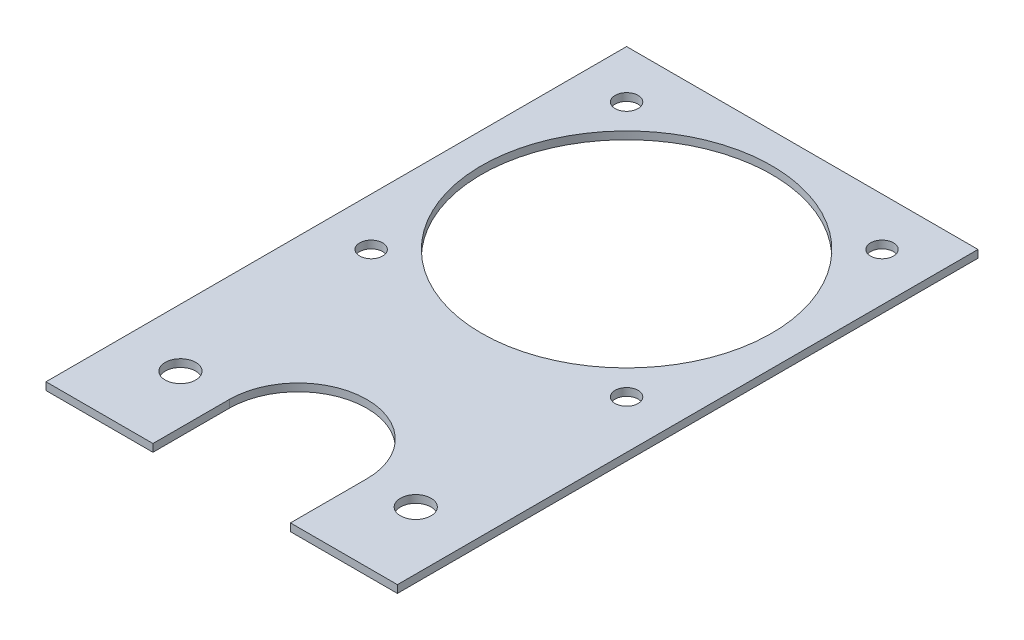
ISO-10303-21;
HEADER;
FILE_DESCRIPTION(('STEP AP214'),'2;1');
FILE_NAME('part.step','',(''),(''),'','','');
FILE_SCHEMA(('AUTOMOTIVE_DESIGN { 1 0 10303 214 1 1 1 1 }'));
ENDSEC;
DATA;
#1=APPLICATION_CONTEXT('core data for automotive mechanical design processes');
#2=APPLICATION_PROTOCOL_DEFINITION('international standard','automotive_design',2000,#1);
#3=PRODUCT_CONTEXT('',#1,'mechanical');
#4=PRODUCT('Part','Part','',(#3));
#5=PRODUCT_RELATED_PRODUCT_CATEGORY('part','',(#4));
#6=PRODUCT_DEFINITION_FORMATION('','',#4);
#7=PRODUCT_DEFINITION_CONTEXT('part definition',#1,'design');
#8=PRODUCT_DEFINITION('design','',#6,#7);
#9=PRODUCT_DEFINITION_SHAPE('','',#8);
#10=(LENGTH_UNIT() NAMED_UNIT(*) SI_UNIT(.MILLI.,.METRE.));
#11=(NAMED_UNIT(*) PLANE_ANGLE_UNIT() SI_UNIT($,.RADIAN.));
#12=(NAMED_UNIT(*) SI_UNIT($,.STERADIAN.) SOLID_ANGLE_UNIT());
#13=UNCERTAINTY_MEASURE_WITH_UNIT(LENGTH_MEASURE(1.E-05),#10,'distance_accuracy_value','');
#14=(GEOMETRIC_REPRESENTATION_CONTEXT(3) GLOBAL_UNCERTAINTY_ASSIGNED_CONTEXT((#13)) GLOBAL_UNIT_ASSIGNED_CONTEXT((#10,
#11,#12)) REPRESENTATION_CONTEXT('',''));
#15=CARTESIAN_POINT('',(0.,0.,0.));
#16=DIRECTION('',(0.,0.,1.));
#17=DIRECTION('',(1.,0.,0.));
#18=AXIS2_PLACEMENT_3D('',#15,#16,#17);
#19=CARTESIAN_POINT('',(-9.,1.,0.));
#20=DIRECTION('',(1.,0.,0.));
#21=DIRECTION('',(0.,0.,-1.));
#22=AXIS2_PLACEMENT_3D('',#19,#20,#21);
#23=PLANE('',#22);
#24=DIRECTION('',(0.,0.,1.));
#25=VECTOR('',#24,1.);
#26=CARTESIAN_POINT('',(-9.,0.,0.));
#27=LINE('',#26,#25);
#28=CARTESIAN_POINT('',(-9.,0.,28.));
#29=VERTEX_POINT('',#28);
#30=CARTESIAN_POINT('',(-9.,0.,38.));
#31=VERTEX_POINT('',#30);
#32=EDGE_CURVE('E155',#29,#31,#27,.T.);
#33=ORIENTED_EDGE('',*,*,#32,.F.);
#34=DIRECTION('',(0.,-1.,0.));
#35=VECTOR('',#34,1.);
#36=CARTESIAN_POINT('',(-9.,1.,28.));
#37=LINE('',#36,#35);
#38=CARTESIAN_POINT('',(-9.,1.,28.));
#39=VERTEX_POINT('',#38);
#40=EDGE_CURVE('E11',#39,#29,#37,.T.);
#41=ORIENTED_EDGE('',*,*,#40,.F.);
#42=DIRECTION('',(0.,0.,1.));
#43=VECTOR('',#42,1.);
#44=CARTESIAN_POINT('',(-9.,1.,0.));
#45=LINE('',#44,#43);
#46=CARTESIAN_POINT('',(-9.,1.,38.));
#47=VERTEX_POINT('',#46);
#48=EDGE_CURVE('E381',#39,#47,#45,.T.);
#49=ORIENTED_EDGE('',*,*,#48,.T.);
#50=DIRECTION('',(0.,-1.,0.));
#51=VECTOR('',#50,1.);
#52=CARTESIAN_POINT('',(-9.,1.,38.));
#53=LINE('',#52,#51);
#54=EDGE_CURVE('E87',#47,#31,#53,.T.);
#55=ORIENTED_EDGE('',*,*,#54,.T.);
#56=EDGE_LOOP('',(#33,#41,#49,#55));
#57=FACE_BOUND('',#56,.T.);
#58=ADVANCED_FACE('F35',(#57),#23,.T.);
#59=CARTESIAN_POINT('',(0.,1.,28.));
#60=DIRECTION('',(0.,-1.,0.));
#61=DIRECTION('',(0.,0.,-1.));
#62=AXIS2_PLACEMENT_3D('',#59,#60,#61);
#63=CYLINDRICAL_SURFACE('',#62,8.99999999999999);
#64=CARTESIAN_POINT('',(0.,0.,28.));
#65=DIRECTION('',(0.,1.,0.));
#66=DIRECTION('',(0.,0.,1.));
#67=AXIS2_PLACEMENT_3D('',#64,#65,#66);
#68=CIRCLE('',#67,8.99999999999999);
#69=CARTESIAN_POINT('',(8.99999999999998,0.,28.));
#70=VERTEX_POINT('',#69);
#71=EDGE_CURVE('E157',#29,#70,#68,.F.);
#72=ORIENTED_EDGE('',*,*,#71,.T.);
#73=DIRECTION('',(0.,-1.,0.));
#74=VECTOR('',#73,1.);
#75=CARTESIAN_POINT('',(8.99999999999998,1.,28.));
#76=LINE('',#75,#74);
#77=CARTESIAN_POINT('',(8.99999999999998,1.,28.));
#78=VERTEX_POINT('',#77);
#79=EDGE_CURVE('E44',#78,#70,#76,.T.);
#80=ORIENTED_EDGE('',*,*,#79,.F.);
#81=CARTESIAN_POINT('',(0.,1.,28.));
#82=DIRECTION('',(0.,1.,0.));
#83=DIRECTION('',(0.,0.,1.));
#84=AXIS2_PLACEMENT_3D('',#81,#82,#83);
#85=CIRCLE('',#84,8.99999999999999);
#86=EDGE_CURVE('E379',#39,#78,#85,.F.);
#87=ORIENTED_EDGE('',*,*,#86,.F.);
#88=ORIENTED_EDGE('',*,*,#40,.T.);
#89=EDGE_LOOP('',(#72,#80,#87,#88));
#90=FACE_BOUND('',#89,.T.);
#91=ADVANCED_FACE('F206',(#90),#63,.F.);
#92=CARTESIAN_POINT('',(8.99999999999997,1.,0.));
#93=DIRECTION('',(1.,0.,0.));
#94=DIRECTION('',(0.,0.,-1.));
#95=AXIS2_PLACEMENT_3D('',#92,#93,#94);
#96=PLANE('',#95);
#97=DIRECTION('',(0.,0.,1.));
#98=VECTOR('',#97,1.);
#99=CARTESIAN_POINT('',(8.99999999999997,0.,0.));
#100=LINE('',#99,#98);
#101=CARTESIAN_POINT('',(8.99999999999999,0.,38.));
#102=VERTEX_POINT('',#101);
#103=EDGE_CURVE('E160',#70,#102,#100,.T.);
#104=ORIENTED_EDGE('',*,*,#103,.T.);
#105=DIRECTION('',(0.,-1.,0.));
#106=VECTOR('',#105,1.);
#107=CARTESIAN_POINT('',(8.99999999999999,1.,38.));
#108=LINE('',#107,#106);
#109=CARTESIAN_POINT('',(8.99999999999999,1.,38.));
#110=VERTEX_POINT('',#109);
#111=EDGE_CURVE('E194',#110,#102,#108,.T.);
#112=ORIENTED_EDGE('',*,*,#111,.F.);
#113=DIRECTION('',(0.,0.,1.));
#114=VECTOR('',#113,1.);
#115=CARTESIAN_POINT('',(8.99999999999997,1.,0.));
#116=LINE('',#115,#114);
#117=EDGE_CURVE('E202',#78,#110,#116,.T.);
#118=ORIENTED_EDGE('',*,*,#117,.F.);
#119=ORIENTED_EDGE('',*,*,#79,.T.);
#120=EDGE_LOOP('',(#104,#112,#118,#119));
#121=FACE_BOUND('',#120,.T.);
#122=ADVANCED_FACE('F199',(#121),#96,.F.);
#123=CARTESIAN_POINT('',(0.,1.,38.));
#124=DIRECTION('',(0.,0.,-1.));
#125=DIRECTION('',(-1.,0.,0.));
#126=AXIS2_PLACEMENT_3D('',#123,#124,#125);
#127=PLANE('',#126);
#128=DIRECTION('',(1.,0.,0.));
#129=VECTOR('',#128,1.);
#130=CARTESIAN_POINT('',(0.,0.,38.));
#131=LINE('',#130,#129);
#132=CARTESIAN_POINT('',(23.,0.,38.));
#133=VERTEX_POINT('',#132);
#134=EDGE_CURVE('E163',#102,#133,#131,.T.);
#135=ORIENTED_EDGE('',*,*,#134,.T.);
#136=DIRECTION('',(0.,-1.,0.));
#137=VECTOR('',#136,1.);
#138=CARTESIAN_POINT('',(23.,1.,38.));
#139=LINE('',#138,#137);
#140=CARTESIAN_POINT('',(23.,1.,38.));
#141=VERTEX_POINT('',#140);
#142=EDGE_CURVE('E192',#141,#133,#139,.T.);
#143=ORIENTED_EDGE('',*,*,#142,.F.);
#144=DIRECTION('',(1.,0.,0.));
#145=VECTOR('',#144,1.);
#146=CARTESIAN_POINT('',(0.,1.,38.));
#147=LINE('',#146,#145);
#148=EDGE_CURVE('E129',#110,#141,#147,.T.);
#149=ORIENTED_EDGE('',*,*,#148,.F.);
#150=ORIENTED_EDGE('',*,*,#111,.T.);
#151=EDGE_LOOP('',(#135,#143,#149,#150));
#152=FACE_BOUND('',#151,.T.);
#153=ADVANCED_FACE('F270',(#152),#127,.F.);
#154=CARTESIAN_POINT('',(23.,1.,0.));
#155=DIRECTION('',(1.,0.,0.));
#156=DIRECTION('',(0.,0.,-1.));
#157=AXIS2_PLACEMENT_3D('',#154,#155,#156);
#158=PLANE('',#157);
#159=DIRECTION('',(0.,0.,1.));
#160=VECTOR('',#159,1.);
#161=CARTESIAN_POINT('',(23.,0.,0.));
#162=LINE('',#161,#160);
#163=CARTESIAN_POINT('',(23.,0.,-38.));
#164=VERTEX_POINT('',#163);
#165=EDGE_CURVE('E166',#164,#133,#162,.T.);
#166=ORIENTED_EDGE('',*,*,#165,.F.);
#167=DIRECTION('',(0.,-1.,0.));
#168=VECTOR('',#167,1.);
#169=CARTESIAN_POINT('',(23.,1.,-38.));
#170=LINE('',#169,#168);
#171=CARTESIAN_POINT('',(23.,1.,-38.));
#172=VERTEX_POINT('',#171);
#173=EDGE_CURVE('E116',#172,#164,#170,.T.);
#174=ORIENTED_EDGE('',*,*,#173,.F.);
#175=DIRECTION('',(0.,0.,1.));
#176=VECTOR('',#175,1.);
#177=CARTESIAN_POINT('',(23.,1.,0.));
#178=LINE('',#177,#176);
#179=EDGE_CURVE('E127',#172,#141,#178,.T.);
#180=ORIENTED_EDGE('',*,*,#179,.T.);
#181=ORIENTED_EDGE('',*,*,#142,.T.);
#182=EDGE_LOOP('',(#166,#174,#180,#181));
#183=FACE_BOUND('',#182,.T.);
#184=ADVANCED_FACE('F267',(#183),#158,.T.);
#185=CARTESIAN_POINT('',(0.,1.,-38.));
#186=DIRECTION('',(0.,0.,-1.));
#187=DIRECTION('',(-1.,0.,0.));
#188=AXIS2_PLACEMENT_3D('',#185,#186,#187);
#189=PLANE('',#188);
#190=DIRECTION('',(1.,0.,0.));
#191=VECTOR('',#190,1.);
#192=CARTESIAN_POINT('',(0.,0.,-38.));
#193=LINE('',#192,#191);
#194=CARTESIAN_POINT('',(-23.,0.,-38.));
#195=VERTEX_POINT('',#194);
#196=EDGE_CURVE('E113',#195,#164,#193,.T.);
#197=ORIENTED_EDGE('',*,*,#196,.F.);
#198=DIRECTION('',(0.,-1.,0.));
#199=VECTOR('',#198,1.);
#200=CARTESIAN_POINT('',(-23.,1.,-38.));
#201=LINE('',#200,#199);
#202=CARTESIAN_POINT('',(-23.,1.,-38.));
#203=VERTEX_POINT('',#202);
#204=EDGE_CURVE('E107',#203,#195,#201,.T.);
#205=ORIENTED_EDGE('',*,*,#204,.F.);
#206=DIRECTION('',(1.,0.,0.));
#207=VECTOR('',#206,1.);
#208=CARTESIAN_POINT('',(0.,1.,-38.));
#209=LINE('',#208,#207);
#210=EDGE_CURVE('E111',#203,#172,#209,.T.);
#211=ORIENTED_EDGE('',*,*,#210,.T.);
#212=ORIENTED_EDGE('',*,*,#173,.T.);
#213=EDGE_LOOP('',(#197,#205,#211,#212));
#214=FACE_BOUND('',#213,.T.);
#215=ADVANCED_FACE('F109',(#214),#189,.T.);
#216=CARTESIAN_POINT('',(-23.,1.,0.));
#217=DIRECTION('',(1.,0.,0.));
#218=DIRECTION('',(0.,0.,-1.));
#219=AXIS2_PLACEMENT_3D('',#216,#217,#218);
#220=PLANE('',#219);
#221=DIRECTION('',(0.,0.,1.));
#222=VECTOR('',#221,1.);
#223=CARTESIAN_POINT('',(-23.,0.,0.));
#224=LINE('',#223,#222);
#225=CARTESIAN_POINT('',(-23.,0.,38.));
#226=VERTEX_POINT('',#225);
#227=EDGE_CURVE('E170',#195,#226,#224,.T.);
#228=ORIENTED_EDGE('',*,*,#227,.T.);
#229=DIRECTION('',(0.,-1.,0.));
#230=VECTOR('',#229,1.);
#231=CARTESIAN_POINT('',(-23.,1.,38.));
#232=LINE('',#231,#230);
#233=CARTESIAN_POINT('',(-23.,1.,38.));
#234=VERTEX_POINT('',#233);
#235=EDGE_CURVE('E117',#234,#226,#232,.T.);
#236=ORIENTED_EDGE('',*,*,#235,.F.);
#237=DIRECTION('',(0.,0.,1.));
#238=VECTOR('',#237,1.);
#239=CARTESIAN_POINT('',(-23.,1.,0.));
#240=LINE('',#239,#238);
#241=EDGE_CURVE('E120',#203,#234,#240,.T.);
#242=ORIENTED_EDGE('',*,*,#241,.F.);
#243=ORIENTED_EDGE('',*,*,#204,.T.);
#244=EDGE_LOOP('',(#228,#236,#242,#243));
#245=FACE_BOUND('',#244,.T.);
#246=ADVANCED_FACE('F121',(#245),#220,.F.);
#247=CARTESIAN_POINT('',(-16.7175144212722,1.,-31.7175144212722));
#248=DIRECTION('',(0.,-1.,0.));
#249=DIRECTION('',(0.,0.,-1.));
#250=AXIS2_PLACEMENT_3D('',#247,#248,#249);
#251=CYLINDRICAL_SURFACE('',#250,1.5);
#252=CARTESIAN_POINT('',(-16.7175144212722,1.,-31.7175144212722));
#253=DIRECTION('',(0.,1.,0.));
#254=DIRECTION('',(0.,0.,1.));
#255=AXIS2_PLACEMENT_3D('',#252,#253,#254);
#256=CIRCLE('',#255,1.5);
#257=CARTESIAN_POINT('',(-16.7175144212722,1.,-30.2175144212722));
#258=VERTEX_POINT('',#257);
#259=EDGE_CURVE('E143',#258,#258,#256,.T.);
#260=ORIENTED_EDGE('',*,*,#259,.T.);
#261=EDGE_LOOP('',(#260));
#262=FACE_BOUND('',#261,.T.);
#263=CARTESIAN_POINT('',(-16.7175144212722,0.,-31.7175144212722));
#264=DIRECTION('',(0.,1.,0.));
#265=DIRECTION('',(0.,0.,1.));
#266=AXIS2_PLACEMENT_3D('',#263,#264,#265);
#267=CIRCLE('',#266,1.5);
#268=CARTESIAN_POINT('',(-16.7175144212722,0.,-30.2175144212722));
#269=VERTEX_POINT('',#268);
#270=EDGE_CURVE('E182',#269,#269,#267,.T.);
#271=ORIENTED_EDGE('',*,*,#270,.F.);
#272=EDGE_LOOP('',(#271));
#273=FACE_BOUND('',#272,.T.);
#274=ADVANCED_FACE('F248',(#262,#273),#251,.F.);
#275=CARTESIAN_POINT('',(16.7175144212722,1.,-31.7175144212722));
#276=DIRECTION('',(0.,-1.,0.));
#277=DIRECTION('',(0.,0.,-1.));
#278=AXIS2_PLACEMENT_3D('',#275,#276,#277);
#279=CYLINDRICAL_SURFACE('',#278,1.5);
#280=CARTESIAN_POINT('',(16.7175144212722,1.,-31.7175144212722));
#281=DIRECTION('',(0.,1.,0.));
#282=DIRECTION('',(0.,0.,1.));
#283=AXIS2_PLACEMENT_3D('',#280,#281,#282);
#284=CIRCLE('',#283,1.5);
#285=CARTESIAN_POINT('',(16.7175144212722,1.,-30.2175144212722));
#286=VERTEX_POINT('',#285);
#287=EDGE_CURVE('E140',#286,#286,#284,.T.);
#288=ORIENTED_EDGE('',*,*,#287,.T.);
#289=EDGE_LOOP('',(#288));
#290=FACE_BOUND('',#289,.T.);
#291=CARTESIAN_POINT('',(16.7175144212722,0.,-31.7175144212722));
#292=DIRECTION('',(0.,1.,0.));
#293=DIRECTION('',(0.,0.,1.));
#294=AXIS2_PLACEMENT_3D('',#291,#292,#293);
#295=CIRCLE('',#294,1.5);
#296=CARTESIAN_POINT('',(16.7175144212722,0.,-30.2175144212722));
#297=VERTEX_POINT('',#296);
#298=EDGE_CURVE('E179',#297,#297,#295,.T.);
#299=ORIENTED_EDGE('',*,*,#298,.F.);
#300=EDGE_LOOP('',(#299));
#301=FACE_BOUND('',#300,.T.);
#302=ADVANCED_FACE('F251',(#290,#301),#279,.F.);
#303=CARTESIAN_POINT('',(16.7175144212722,1.,1.71751442127219));
#304=DIRECTION('',(0.,-1.,0.));
#305=DIRECTION('',(0.,0.,-1.));
#306=AXIS2_PLACEMENT_3D('',#303,#304,#305);
#307=CYLINDRICAL_SURFACE('',#306,1.5);
#308=CARTESIAN_POINT('',(16.7175144212722,1.,1.71751442127219));
#309=DIRECTION('',(0.,1.,0.));
#310=DIRECTION('',(0.,0.,1.));
#311=AXIS2_PLACEMENT_3D('',#308,#309,#310);
#312=CIRCLE('',#311,1.5);
#313=CARTESIAN_POINT('',(16.7175144212722,1.,3.21751442127219));
#314=VERTEX_POINT('',#313);
#315=EDGE_CURVE('E137',#314,#314,#312,.T.);
#316=ORIENTED_EDGE('',*,*,#315,.T.);
#317=EDGE_LOOP('',(#316));
#318=FACE_BOUND('',#317,.T.);
#319=CARTESIAN_POINT('',(16.7175144212722,0.,1.71751442127219));
#320=DIRECTION('',(0.,1.,0.));
#321=DIRECTION('',(0.,0.,1.));
#322=AXIS2_PLACEMENT_3D('',#319,#320,#321);
#323=CIRCLE('',#322,1.5);
#324=CARTESIAN_POINT('',(16.7175144212722,0.,3.21751442127219));
#325=VERTEX_POINT('',#324);
#326=EDGE_CURVE('E176',#325,#325,#323,.T.);
#327=ORIENTED_EDGE('',*,*,#326,.F.);
#328=EDGE_LOOP('',(#327));
#329=FACE_BOUND('',#328,.T.);
#330=ADVANCED_FACE('F255',(#318,#329),#307,.F.);
#331=CARTESIAN_POINT('',(-16.7175144212722,1.,1.71751442127221));
#332=DIRECTION('',(0.,-1.,0.));
#333=DIRECTION('',(0.,0.,-1.));
#334=AXIS2_PLACEMENT_3D('',#331,#332,#333);
#335=CYLINDRICAL_SURFACE('',#334,1.5);
#336=CARTESIAN_POINT('',(-16.7175144212722,1.,1.71751442127221));
#337=DIRECTION('',(0.,1.,0.));
#338=DIRECTION('',(0.,0.,1.));
#339=AXIS2_PLACEMENT_3D('',#336,#337,#338);
#340=CIRCLE('',#339,1.5);
#341=CARTESIAN_POINT('',(-16.7175144212722,1.,3.21751442127221));
#342=VERTEX_POINT('',#341);
#343=EDGE_CURVE('E134',#342,#342,#340,.T.);
#344=ORIENTED_EDGE('',*,*,#343,.T.);
#345=EDGE_LOOP('',(#344));
#346=FACE_BOUND('',#345,.T.);
#347=CARTESIAN_POINT('',(-16.7175144212722,0.,1.71751442127221));
#348=DIRECTION('',(0.,1.,0.));
#349=DIRECTION('',(0.,0.,1.));
#350=AXIS2_PLACEMENT_3D('',#347,#348,#349);
#351=CIRCLE('',#350,1.5);
#352=CARTESIAN_POINT('',(-16.7175144212722,0.,3.21751442127221));
#353=VERTEX_POINT('',#352);
#354=EDGE_CURVE('E173',#353,#353,#351,.T.);
#355=ORIENTED_EDGE('',*,*,#354,.F.);
#356=EDGE_LOOP('',(#355));
#357=FACE_BOUND('',#356,.T.);
#358=ADVANCED_FACE('F226',(#346,#357),#335,.F.);
#359=CARTESIAN_POINT('',(0.,1.,38.));
#360=DIRECTION('',(0.,0.,-1.));
#361=DIRECTION('',(-1.,0.,0.));
#362=AXIS2_PLACEMENT_3D('',#359,#360,#361);
#363=PLANE('',#362);
#364=DIRECTION('',(1.,0.,0.));
#365=VECTOR('',#364,1.);
#366=CARTESIAN_POINT('',(0.,0.,38.));
#367=LINE('',#366,#365);
#368=EDGE_CURVE('E80',#226,#31,#367,.T.);
#369=ORIENTED_EDGE('',*,*,#368,.T.);
#370=ORIENTED_EDGE('',*,*,#54,.F.);
#371=DIRECTION('',(1.,0.,0.));
#372=VECTOR('',#371,1.);
#373=CARTESIAN_POINT('',(0.,1.,38.));
#374=LINE('',#373,#372);
#375=EDGE_CURVE('E52',#234,#47,#374,.T.);
#376=ORIENTED_EDGE('',*,*,#375,.F.);
#377=ORIENTED_EDGE('',*,*,#235,.T.);
#378=EDGE_LOOP('',(#369,#370,#376,#377));
#379=FACE_BOUND('',#378,.T.);
#380=ADVANCED_FACE('F218',(#379),#363,.F.);
#381=CARTESIAN_POINT('',(-15.4,1.,28.));
#382=DIRECTION('',(0.,-1.,0.));
#383=DIRECTION('',(0.,0.,-1.));
#384=AXIS2_PLACEMENT_3D('',#381,#382,#383);
#385=CYLINDRICAL_SURFACE('',#384,2.);
#386=CARTESIAN_POINT('',(-15.4,1.,28.));
#387=DIRECTION('',(0.,1.,0.));
#388=DIRECTION('',(0.,0.,1.));
#389=AXIS2_PLACEMENT_3D('',#386,#387,#388);
#390=CIRCLE('',#389,2.);
#391=CARTESIAN_POINT('',(-15.4,1.,30.));
#392=VERTEX_POINT('',#391);
#393=EDGE_CURVE('E232',#392,#392,#390,.T.);
#394=ORIENTED_EDGE('',*,*,#393,.T.);
#395=EDGE_LOOP('',(#394));
#396=FACE_BOUND('',#395,.T.);
#397=CARTESIAN_POINT('',(-15.4,0.,28.));
#398=DIRECTION('',(0.,1.,0.));
#399=DIRECTION('',(0.,0.,1.));
#400=AXIS2_PLACEMENT_3D('',#397,#398,#399);
#401=CIRCLE('',#400,2.);
#402=CARTESIAN_POINT('',(-15.4,0.,30.));
#403=VERTEX_POINT('',#402);
#404=EDGE_CURVE('E152',#403,#403,#401,.T.);
#405=ORIENTED_EDGE('',*,*,#404,.F.);
#406=EDGE_LOOP('',(#405));
#407=FACE_BOUND('',#406,.T.);
#408=ADVANCED_FACE('F216',(#396,#407),#385,.F.);
#409=CARTESIAN_POINT('',(15.4,1.,28.));
#410=DIRECTION('',(0.,-1.,0.));
#411=DIRECTION('',(0.,0.,-1.));
#412=AXIS2_PLACEMENT_3D('',#409,#410,#411);
#413=CYLINDRICAL_SURFACE('',#412,2.);
#414=CARTESIAN_POINT('',(15.4,1.,28.));
#415=DIRECTION('',(0.,1.,0.));
#416=DIRECTION('',(0.,0.,1.));
#417=AXIS2_PLACEMENT_3D('',#414,#415,#416);
#418=CIRCLE('',#417,2.);
#419=CARTESIAN_POINT('',(15.4,1.,30.));
#420=VERTEX_POINT('',#419);
#421=EDGE_CURVE('E188',#420,#420,#418,.F.);
#422=ORIENTED_EDGE('',*,*,#421,.F.);
#423=EDGE_LOOP('',(#422));
#424=FACE_BOUND('',#423,.T.);
#425=CARTESIAN_POINT('',(15.4,0.,28.));
#426=DIRECTION('',(0.,1.,0.));
#427=DIRECTION('',(0.,0.,1.));
#428=AXIS2_PLACEMENT_3D('',#425,#426,#427);
#429=CIRCLE('',#428,2.);
#430=CARTESIAN_POINT('',(15.4,0.,30.));
#431=VERTEX_POINT('',#430);
#432=EDGE_CURVE('E149',#431,#431,#429,.F.);
#433=ORIENTED_EDGE('',*,*,#432,.T.);
#434=EDGE_LOOP('',(#433));
#435=FACE_BOUND('',#434,.T.);
#436=ADVANCED_FACE('F37',(#424,#435),#413,.F.);
#437=CARTESIAN_POINT('',(0.,1.,-15.));
#438=DIRECTION('',(0.,-1.,0.));
#439=DIRECTION('',(0.,0.,-1.));
#440=AXIS2_PLACEMENT_3D('',#437,#438,#439);
#441=CYLINDRICAL_SURFACE('',#440,19.);
#442=CARTESIAN_POINT('',(0.,1.,-15.));
#443=DIRECTION('',(0.,1.,0.));
#444=DIRECTION('',(0.,0.,1.));
#445=AXIS2_PLACEMENT_3D('',#442,#443,#444);
#446=CIRCLE('',#445,19.);
#447=CARTESIAN_POINT('',(0.,1.,4.));
#448=VERTEX_POINT('',#447);
#449=EDGE_CURVE('E146',#448,#448,#446,.T.);
#450=ORIENTED_EDGE('',*,*,#449,.T.);
#451=EDGE_LOOP('',(#450));
#452=FACE_BOUND('',#451,.T.);
#453=CARTESIAN_POINT('',(0.,0.,-15.));
#454=DIRECTION('',(0.,1.,0.));
#455=DIRECTION('',(0.,0.,1.));
#456=AXIS2_PLACEMENT_3D('',#453,#454,#455);
#457=CIRCLE('',#456,19.);
#458=CARTESIAN_POINT('',(0.,0.,4.));
#459=VERTEX_POINT('',#458);
#460=EDGE_CURVE('E185',#459,#459,#457,.T.);
#461=ORIENTED_EDGE('',*,*,#460,.F.);
#462=EDGE_LOOP('',(#461));
#463=FACE_BOUND('',#462,.T.);
#464=ADVANCED_FACE('F224',(#452,#463),#441,.F.);
#465=CARTESIAN_POINT('',(0.,1.,0.));
#466=DIRECTION('',(0.,1.,0.));
#467=DIRECTION('',(0.,0.,1.));
#468=AXIS2_PLACEMENT_3D('',#465,#466,#467);
#469=PLANE('',#468);
#470=ORIENTED_EDGE('',*,*,#421,.T.);
#471=EDGE_LOOP('',(#470));
#472=FACE_BOUND('',#471,.T.);
#473=ORIENTED_EDGE('',*,*,#393,.F.);
#474=EDGE_LOOP('',(#473));
#475=FACE_BOUND('',#474,.T.);
#476=ORIENTED_EDGE('',*,*,#48,.F.);
#477=ORIENTED_EDGE('',*,*,#86,.T.);
#478=ORIENTED_EDGE('',*,*,#117,.T.);
#479=ORIENTED_EDGE('',*,*,#148,.T.);
#480=ORIENTED_EDGE('',*,*,#179,.F.);
#481=ORIENTED_EDGE('',*,*,#210,.F.);
#482=ORIENTED_EDGE('',*,*,#241,.T.);
#483=ORIENTED_EDGE('',*,*,#375,.T.);
#484=EDGE_LOOP('',(#476,#477,#478,#479,#480,#481,#482,#483));
#485=FACE_BOUND('',#484,.T.);
#486=ORIENTED_EDGE('',*,*,#343,.F.);
#487=EDGE_LOOP('',(#486));
#488=FACE_BOUND('',#487,.T.);
#489=ORIENTED_EDGE('',*,*,#315,.F.);
#490=EDGE_LOOP('',(#489));
#491=FACE_BOUND('',#490,.T.);
#492=ORIENTED_EDGE('',*,*,#287,.F.);
#493=EDGE_LOOP('',(#492));
#494=FACE_BOUND('',#493,.T.);
#495=ORIENTED_EDGE('',*,*,#259,.F.);
#496=EDGE_LOOP('',(#495));
#497=FACE_BOUND('',#496,.T.);
#498=ORIENTED_EDGE('',*,*,#449,.F.);
#499=EDGE_LOOP('',(#498));
#500=FACE_BOUND('',#499,.T.);
#501=ADVANCED_FACE('F124',(#472,#475,#485,#488,#491,#494,#497,#500),#469,.T.);
#502=CARTESIAN_POINT('',(0.,0.,0.));
#503=DIRECTION('',(0.,1.,0.));
#504=DIRECTION('',(0.,0.,1.));
#505=AXIS2_PLACEMENT_3D('',#502,#503,#504);
#506=PLANE('',#505);
#507=ORIENTED_EDGE('',*,*,#432,.F.);
#508=EDGE_LOOP('',(#507));
#509=FACE_BOUND('',#508,.T.);
#510=ORIENTED_EDGE('',*,*,#404,.T.);
#511=EDGE_LOOP('',(#510));
#512=FACE_BOUND('',#511,.T.);
#513=ORIENTED_EDGE('',*,*,#32,.T.);
#514=ORIENTED_EDGE('',*,*,#368,.F.);
#515=ORIENTED_EDGE('',*,*,#227,.F.);
#516=ORIENTED_EDGE('',*,*,#196,.T.);
#517=ORIENTED_EDGE('',*,*,#165,.T.);
#518=ORIENTED_EDGE('',*,*,#134,.F.);
#519=ORIENTED_EDGE('',*,*,#103,.F.);
#520=ORIENTED_EDGE('',*,*,#71,.F.);
#521=EDGE_LOOP('',(#513,#514,#515,#516,#517,#518,#519,#520));
#522=FACE_BOUND('',#521,.T.);
#523=ORIENTED_EDGE('',*,*,#354,.T.);
#524=EDGE_LOOP('',(#523));
#525=FACE_BOUND('',#524,.T.);
#526=ORIENTED_EDGE('',*,*,#326,.T.);
#527=EDGE_LOOP('',(#526));
#528=FACE_BOUND('',#527,.T.);
#529=ORIENTED_EDGE('',*,*,#298,.T.);
#530=EDGE_LOOP('',(#529));
#531=FACE_BOUND('',#530,.T.);
#532=ORIENTED_EDGE('',*,*,#270,.T.);
#533=EDGE_LOOP('',(#532));
#534=FACE_BOUND('',#533,.T.);
#535=ORIENTED_EDGE('',*,*,#460,.T.);
#536=EDGE_LOOP('',(#535));
#537=FACE_BOUND('',#536,.T.);
#538=ADVANCED_FACE('F207',(#509,#512,#522,#525,#528,#531,#534,#537),#506,.F.);
#539=CLOSED_SHELL('',(#58,#91,#122,#153,#184,#215,#246,#274,#302,#330,#358,#380,#408,#436,#464,
#501,#538));
#540=MANIFOLD_SOLID_BREP('B2',#539);
#541=ADVANCED_BREP_SHAPE_REPRESENTATION('',(#18,#540),#14);
#542=SHAPE_DEFINITION_REPRESENTATION(#9,#541);
ENDSEC;
END-ISO-10303-21;
